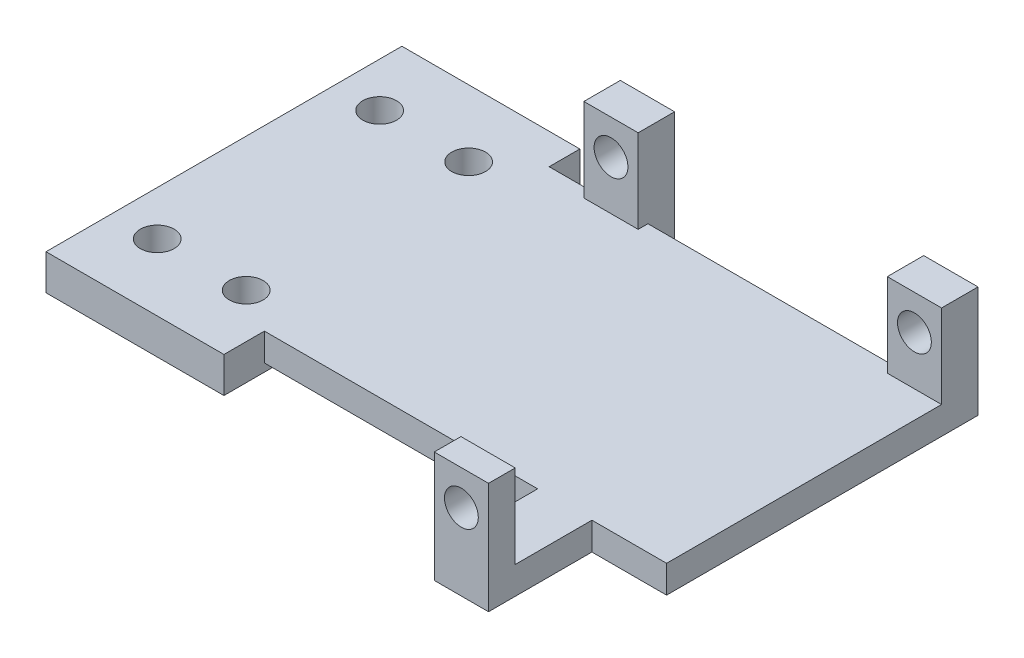
ISO-10303-21;
HEADER;
FILE_DESCRIPTION(('STEP AP214'),'2;1');
FILE_NAME('part.step','',(''),(''),'','','');
FILE_SCHEMA(('AUTOMOTIVE_DESIGN { 1 0 10303 214 1 1 1 1 }'));
ENDSEC;
DATA;
#1=APPLICATION_CONTEXT('core data for automotive mechanical design processes');
#2=APPLICATION_PROTOCOL_DEFINITION('international standard','automotive_design',2000,#1);
#3=PRODUCT_CONTEXT('',#1,'mechanical');
#4=PRODUCT('Part','Part','',(#3));
#5=PRODUCT_RELATED_PRODUCT_CATEGORY('part','',(#4));
#6=PRODUCT_DEFINITION_FORMATION('','',#4);
#7=PRODUCT_DEFINITION_CONTEXT('part definition',#1,'design');
#8=PRODUCT_DEFINITION('design','',#6,#7);
#9=PRODUCT_DEFINITION_SHAPE('','',#8);
#10=(LENGTH_UNIT() NAMED_UNIT(*) SI_UNIT(.MILLI.,.METRE.));
#11=(NAMED_UNIT(*) PLANE_ANGLE_UNIT() SI_UNIT($,.RADIAN.));
#12=(NAMED_UNIT(*) SI_UNIT($,.STERADIAN.) SOLID_ANGLE_UNIT());
#13=UNCERTAINTY_MEASURE_WITH_UNIT(LENGTH_MEASURE(1.E-05),#10,'distance_accuracy_value','');
#14=(GEOMETRIC_REPRESENTATION_CONTEXT(3) GLOBAL_UNCERTAINTY_ASSIGNED_CONTEXT((#13)) GLOBAL_UNIT_ASSIGNED_CONTEXT((#10,
#11,#12)) REPRESENTATION_CONTEXT('',''));
#15=CARTESIAN_POINT('',(0.,0.,0.));
#16=DIRECTION('',(0.,0.,1.));
#17=DIRECTION('',(1.,0.,0.));
#18=AXIS2_PLACEMENT_3D('',#15,#16,#17);
#19=CARTESIAN_POINT('',(-15.,-1.89713612671244,-32.));
#20=DIRECTION('',(0.,0.,-1.));
#21=DIRECTION('',(-1.,0.,0.));
#22=AXIS2_PLACEMENT_3D('',#19,#20,#21);
#23=PLANE('',#22);
#24=DIRECTION('',(0.,-1.,0.));
#25=VECTOR('',#24,1.);
#26=CARTESIAN_POINT('',(0.,-1.89713612671244,-32.));
#27=LINE('',#26,#25);
#28=CARTESIAN_POINT('',(0.,-1.89713612671244,-32.));
#29=VERTEX_POINT('',#28);
#30=CARTESIAN_POINT('',(0.,-5.,-32.));
#31=VERTEX_POINT('',#30);
#32=EDGE_CURVE('E56',#29,#31,#27,.T.);
#33=ORIENTED_EDGE('',*,*,#32,.F.);
#34=DIRECTION('',(1.,0.,0.));
#35=VECTOR('',#34,1.);
#36=CARTESIAN_POINT('',(-15.,-1.89713612671244,-32.));
#37=LINE('',#36,#35);
#38=CARTESIAN_POINT('',(5.,-1.89713612671244,-32.));
#39=VERTEX_POINT('',#38);
#40=EDGE_CURVE('E35',#29,#39,#37,.T.);
#41=ORIENTED_EDGE('',*,*,#40,.T.);
#42=DIRECTION('',(0.,1.,0.));
#43=VECTOR('',#42,1.);
#44=CARTESIAN_POINT('',(4.99999999999999,7.50286387328756,-32.));
#45=LINE('',#44,#43);
#46=CARTESIAN_POINT('',(5.,-5.,-32.));
#47=VERTEX_POINT('',#46);
#48=EDGE_CURVE('E251',#47,#39,#45,.T.);
#49=ORIENTED_EDGE('',*,*,#48,.F.);
#50=DIRECTION('',(1.,0.,0.));
#51=VECTOR('',#50,1.);
#52=CARTESIAN_POINT('',(-15.,-5.,-32.));
#53=LINE('',#52,#51);
#54=EDGE_CURVE('E366',#31,#47,#53,.T.);
#55=ORIENTED_EDGE('',*,*,#54,.F.);
#56=EDGE_LOOP('',(#33,#41,#49,#55));
#57=FACE_BOUND('',#56,.T.);
#58=ADVANCED_FACE('F32',(#57),#23,.T.);
#59=CARTESIAN_POINT('',(11.1,-5.,-32.));
#60=VERTEX_POINT('',#59);
#61=CARTESIAN_POINT('',(39.1,-5.,-32.));
#62=VERTEX_POINT('',#61);
#63=EDGE_CURVE('E363',#60,#62,#53,.T.);
#64=ORIENTED_EDGE('',*,*,#63,.F.);
#65=DIRECTION('',(0.,-1.,0.));
#66=VECTOR('',#65,1.);
#67=CARTESIAN_POINT('',(11.1,-1.89713612671244,-32.));
#68=LINE('',#67,#66);
#69=CARTESIAN_POINT('',(11.1,-1.89713612671244,-32.));
#70=VERTEX_POINT('',#69);
#71=EDGE_CURVE('E256',#70,#60,#68,.T.);
#72=ORIENTED_EDGE('',*,*,#71,.F.);
#73=CARTESIAN_POINT('',(39.1,-1.89713612671244,-32.));
#74=VERTEX_POINT('',#73);
#75=EDGE_CURVE('E375',#70,#74,#37,.T.);
#76=ORIENTED_EDGE('',*,*,#75,.T.);
#77=DIRECTION('',(0.,1.,0.));
#78=VECTOR('',#77,1.);
#79=CARTESIAN_POINT('',(39.1,7.50286387328753,-32.));
#80=LINE('',#79,#78);
#81=EDGE_CURVE('E277',#62,#74,#80,.T.);
#82=ORIENTED_EDGE('',*,*,#81,.F.);
#83=EDGE_LOOP('',(#64,#72,#76,#82));
#84=FACE_BOUND('',#83,.T.);
#85=ADVANCED_FACE('F483',(#84),#23,.T.);
#86=CARTESIAN_POINT('',(-15.,-1.89713612671244,0.));
#87=DIRECTION('',(0.,0.,1.));
#88=DIRECTION('',(1.,0.,0.));
#89=AXIS2_PLACEMENT_3D('',#86,#87,#88);
#90=PLANE('',#89);
#91=DIRECTION('',(0.,1.,0.));
#92=VECTOR('',#91,1.);
#93=CARTESIAN_POINT('',(0.,-1.89713612671244,0.));
#94=LINE('',#93,#92);
#95=CARTESIAN_POINT('',(0.,-5.,0.));
#96=VERTEX_POINT('',#95);
#97=CARTESIAN_POINT('',(0.,-1.89713612671244,0.));
#98=VERTEX_POINT('',#97);
#99=EDGE_CURVE('E241',#96,#98,#94,.T.);
#100=ORIENTED_EDGE('',*,*,#99,.F.);
#101=DIRECTION('',(-1.,0.,0.));
#102=VECTOR('',#101,1.);
#103=CARTESIAN_POINT('',(-15.,-5.,0.));
#104=LINE('',#103,#102);
#105=CARTESIAN_POINT('',(30.71,-5.,0.));
#106=VERTEX_POINT('',#105);
#107=EDGE_CURVE('E379',#106,#96,#104,.T.);
#108=ORIENTED_EDGE('',*,*,#107,.F.);
#109=DIRECTION('',(0.,1.,0.));
#110=VECTOR('',#109,1.);
#111=CARTESIAN_POINT('',(30.71,-18.1254542411129,0.));
#112=LINE('',#111,#110);
#113=CARTESIAN_POINT('',(30.71,-1.89713612671244,0.));
#114=VERTEX_POINT('',#113);
#115=EDGE_CURVE('E332',#106,#114,#112,.T.);
#116=ORIENTED_EDGE('',*,*,#115,.T.);
#117=DIRECTION('',(-1.,0.,0.));
#118=VECTOR('',#117,1.);
#119=CARTESIAN_POINT('',(-15.,-1.89713612671244,0.));
#120=LINE('',#119,#118);
#121=EDGE_CURVE('E48',#114,#98,#120,.T.);
#122=ORIENTED_EDGE('',*,*,#121,.T.);
#123=EDGE_LOOP('',(#100,#108,#116,#122));
#124=FACE_BOUND('',#123,.T.);
#125=ADVANCED_FACE('F528',(#124),#90,.T.);
#126=CARTESIAN_POINT('',(0.,-1.89713612671244,0.));
#127=DIRECTION('',(0.,-1.,0.));
#128=DIRECTION('',(0.,0.,-1.));
#129=AXIS2_PLACEMENT_3D('',#126,#127,#128);
#130=PLANE('',#129);
#131=CARTESIAN_POINT('',(-5.,-1.89713612671244,-2.9525));
#132=DIRECTION('',(0.,1.,0.));
#133=DIRECTION('',(0.,0.,1.));
#134=AXIS2_PLACEMENT_3D('',#131,#132,#133);
#135=CIRCLE('',#134,1.9);
#136=CARTESIAN_POINT('',(-5.,-1.89713612671244,-1.0525));
#137=VERTEX_POINT('',#136);
#138=EDGE_CURVE('E894',#137,#137,#135,.T.);
#139=ORIENTED_EDGE('',*,*,#138,.F.);
#140=EDGE_LOOP('',(#139));
#141=FACE_BOUND('',#140,.T.);
#142=CARTESIAN_POINT('',(-15.,-1.89713612671244,-2.9525));
#143=DIRECTION('',(0.,1.,0.));
#144=DIRECTION('',(0.,0.,1.));
#145=AXIS2_PLACEMENT_3D('',#142,#143,#144);
#146=CIRCLE('',#145,1.9);
#147=CARTESIAN_POINT('',(-15.,-1.89713612671244,-1.0525));
#148=VERTEX_POINT('',#147);
#149=EDGE_CURVE('E896',#148,#148,#146,.T.);
#150=ORIENTED_EDGE('',*,*,#149,.F.);
#151=EDGE_LOOP('',(#150));
#152=FACE_BOUND('',#151,.T.);
#153=CARTESIAN_POINT('',(-5.,-1.89713612671244,-27.9525));
#154=DIRECTION('',(0.,1.,0.));
#155=DIRECTION('',(0.,0.,1.));
#156=AXIS2_PLACEMENT_3D('',#153,#154,#155);
#157=CIRCLE('',#156,1.9);
#158=CARTESIAN_POINT('',(-5.,-1.89713612671244,-26.0525));
#159=VERTEX_POINT('',#158);
#160=EDGE_CURVE('E902',#159,#159,#157,.T.);
#161=ORIENTED_EDGE('',*,*,#160,.F.);
#162=EDGE_LOOP('',(#161));
#163=FACE_BOUND('',#162,.T.);
#164=CARTESIAN_POINT('',(-15.,-1.89713612671244,-27.9525));
#165=DIRECTION('',(0.,1.,0.));
#166=DIRECTION('',(0.,0.,1.));
#167=AXIS2_PLACEMENT_3D('',#164,#165,#166);
#168=CIRCLE('',#167,1.89999999999999);
#169=CARTESIAN_POINT('',(-15.,-1.89713612671244,-26.0525));
#170=VERTEX_POINT('',#169);
#171=EDGE_CURVE('E228',#170,#170,#168,.T.);
#172=ORIENTED_EDGE('',*,*,#171,.F.);
#173=EDGE_LOOP('',(#172));
#174=FACE_BOUND('',#173,.T.);
#175=ORIENTED_EDGE('',*,*,#40,.F.);
#176=DIRECTION('',(0.,0.,-1.));
#177=VECTOR('',#176,1.);
#178=CARTESIAN_POINT('',(0.,-1.89713612671244,-35.4525));
#179=LINE('',#178,#177);
#180=CARTESIAN_POINT('',(0.,-1.89713612671244,-35.4525));
#181=VERTEX_POINT('',#180);
#182=EDGE_CURVE('E237',#29,#181,#179,.T.);
#183=ORIENTED_EDGE('',*,*,#182,.T.);
#184=DIRECTION('',(-1.,0.,0.));
#185=VECTOR('',#184,1.);
#186=CARTESIAN_POINT('',(-20.,-1.89713612671244,-35.4525));
#187=LINE('',#186,#185);
#188=CARTESIAN_POINT('',(-20.,-1.89713612671244,-35.4525));
#189=VERTEX_POINT('',#188);
#190=EDGE_CURVE('E222',#181,#189,#187,.T.);
#191=ORIENTED_EDGE('',*,*,#190,.T.);
#192=DIRECTION('',(0.,0.,1.));
#193=VECTOR('',#192,1.);
#194=CARTESIAN_POINT('',(-20.,-1.89713612671244,-35.4525));
#195=LINE('',#194,#193);
#196=CARTESIAN_POINT('',(-20.,-1.89713612671244,4.54750000000001));
#197=VERTEX_POINT('',#196);
#198=EDGE_CURVE('E233',#189,#197,#195,.T.);
#199=ORIENTED_EDGE('',*,*,#198,.T.);
#200=DIRECTION('',(1.,0.,0.));
#201=VECTOR('',#200,1.);
#202=CARTESIAN_POINT('',(-20.,-1.89713612671244,4.54750000000001));
#203=LINE('',#202,#201);
#204=CARTESIAN_POINT('',(0.,-1.89713612671244,4.54750000000001));
#205=VERTEX_POINT('',#204);
#206=EDGE_CURVE('E202',#197,#205,#203,.T.);
#207=ORIENTED_EDGE('',*,*,#206,.T.);
#208=EDGE_CURVE('E225',#205,#98,#179,.T.);
#209=ORIENTED_EDGE('',*,*,#208,.T.);
#210=ORIENTED_EDGE('',*,*,#121,.F.);
#211=DIRECTION('',(0.,0.,1.));
#212=VECTOR('',#211,1.);
#213=CARTESIAN_POINT('',(30.71,-1.89713612671244,11.621856522757));
#214=LINE('',#213,#212);
#215=CARTESIAN_POINT('',(30.71,-1.89713612671245,8.62185652275697));
#216=VERTEX_POINT('',#215);
#217=EDGE_CURVE('E319',#114,#216,#214,.T.);
#218=ORIENTED_EDGE('',*,*,#217,.T.);
#219=DIRECTION('',(1.,0.,0.));
#220=VECTOR('',#219,1.);
#221=CARTESIAN_POINT('',(30.71,-1.89713612671244,8.62185652275697));
#222=LINE('',#221,#220);
#223=CARTESIAN_POINT('',(36.81,-1.89713612671245,8.62185652275697));
#224=VERTEX_POINT('',#223);
#225=EDGE_CURVE('E305',#216,#224,#222,.T.);
#226=ORIENTED_EDGE('',*,*,#225,.T.);
#227=DIRECTION('',(0.,0.,-1.));
#228=VECTOR('',#227,1.);
#229=CARTESIAN_POINT('',(36.81,-1.89713612671244,11.621856522757));
#230=LINE('',#229,#228);
#231=CARTESIAN_POINT('',(36.81,-1.89713612671244,0.));
#232=VERTEX_POINT('',#231);
#233=EDGE_CURVE('E326',#224,#232,#230,.T.);
#234=ORIENTED_EDGE('',*,*,#233,.T.);
#235=CARTESIAN_POINT('',(45.2,-1.89713612671244,0.));
#236=VERTEX_POINT('',#235);
#237=EDGE_CURVE('E41',#236,#232,#120,.T.);
#238=ORIENTED_EDGE('',*,*,#237,.F.);
#239=DIRECTION('',(0.,0.,1.));
#240=VECTOR('',#239,1.);
#241=CARTESIAN_POINT('',(45.2,-1.89713612671244,0.));
#242=LINE('',#241,#240);
#243=CARTESIAN_POINT('',(45.2,-1.89713612671244,-30.905));
#244=VERTEX_POINT('',#243);
#245=EDGE_CURVE('E434',#244,#236,#242,.T.);
#246=ORIENTED_EDGE('',*,*,#245,.F.);
#247=DIRECTION('',(-1.,0.,0.));
#248=VECTOR('',#247,1.);
#249=CARTESIAN_POINT('',(39.1,-1.89713612671244,-30.905));
#250=LINE('',#249,#248);
#251=CARTESIAN_POINT('',(39.1,-1.89713612671244,-30.905));
#252=VERTEX_POINT('',#251);
#253=EDGE_CURVE('E424',#244,#252,#250,.T.);
#254=ORIENTED_EDGE('',*,*,#253,.T.);
#255=DIRECTION('',(0.,0.,1.));
#256=VECTOR('',#255,1.);
#257=CARTESIAN_POINT('',(39.1,-1.89713612671244,-43.2058020685714));
#258=LINE('',#257,#256);
#259=EDGE_CURVE('E353',#74,#252,#258,.T.);
#260=ORIENTED_EDGE('',*,*,#259,.F.);
#261=ORIENTED_EDGE('',*,*,#75,.F.);
#262=DIRECTION('',(0.,0.,1.));
#263=VECTOR('',#262,1.);
#264=CARTESIAN_POINT('',(11.1,-1.89713612671245,-43.2058020685714));
#265=LINE('',#264,#263);
#266=CARTESIAN_POINT('',(11.1,-1.89713612671245,-30.905));
#267=VERTEX_POINT('',#266);
#268=EDGE_CURVE('E367',#70,#267,#265,.T.);
#269=ORIENTED_EDGE('',*,*,#268,.T.);
#270=DIRECTION('',(-1.,0.,0.));
#271=VECTOR('',#270,1.);
#272=CARTESIAN_POINT('',(11.1,-1.89713612671245,-30.905));
#273=LINE('',#272,#271);
#274=CARTESIAN_POINT('',(5.,-1.89713612671245,-30.905));
#275=VERTEX_POINT('',#274);
#276=EDGE_CURVE('E405',#267,#275,#273,.T.);
#277=ORIENTED_EDGE('',*,*,#276,.T.);
#278=DIRECTION('',(0.,0.,1.));
#279=VECTOR('',#278,1.);
#280=CARTESIAN_POINT('',(5.,-1.89713612671245,-43.2058020685714));
#281=LINE('',#280,#279);
#282=EDGE_CURVE('E389',#39,#275,#281,.T.);
#283=ORIENTED_EDGE('',*,*,#282,.F.);
#284=EDGE_LOOP('',(#175,#183,#191,#199,#207,#209,#210,#218,#226,#234,#238,#246,#254,#260,#261,
#269,#277,#283));
#285=FACE_BOUND('',#284,.T.);
#286=ADVANCED_FACE('F459',(#141,#152,#163,#174,#285),#130,.F.);
#287=DIRECTION('',(0.,1.,0.));
#288=VECTOR('',#287,1.);
#289=CARTESIAN_POINT('',(36.81,-18.1254542411129,0.));
#290=LINE('',#289,#288);
#291=CARTESIAN_POINT('',(36.81,-5.,0.));
#292=VERTEX_POINT('',#291);
#293=EDGE_CURVE('E336',#292,#232,#290,.T.);
#294=ORIENTED_EDGE('',*,*,#293,.F.);
#295=CARTESIAN_POINT('',(45.2,-5.,0.));
#296=VERTEX_POINT('',#295);
#297=EDGE_CURVE('E381',#296,#292,#104,.T.);
#298=ORIENTED_EDGE('',*,*,#297,.F.);
#299=DIRECTION('',(0.,1.,0.));
#300=VECTOR('',#299,1.);
#301=CARTESIAN_POINT('',(45.2,-5.,0.));
#302=LINE('',#301,#300);
#303=EDGE_CURVE('E430',#296,#236,#302,.T.);
#304=ORIENTED_EDGE('',*,*,#303,.T.);
#305=ORIENTED_EDGE('',*,*,#237,.T.);
#306=EDGE_LOOP('',(#294,#298,#304,#305));
#307=FACE_BOUND('',#306,.T.);
#308=ADVANCED_FACE('F464',(#307),#90,.T.);
#309=CARTESIAN_POINT('',(0.,-5.,0.));
#310=DIRECTION('',(0.,-1.,0.));
#311=DIRECTION('',(0.,0.,-1.));
#312=AXIS2_PLACEMENT_3D('',#309,#310,#311);
#313=PLANE('',#312);
#314=DIRECTION('',(0.,0.,1.));
#315=VECTOR('',#314,1.);
#316=CARTESIAN_POINT('',(0.,-5.,0.));
#317=LINE('',#316,#315);
#318=EDGE_CURVE('E11',#31,#96,#317,.T.);
#319=ORIENTED_EDGE('',*,*,#318,.F.);
#320=ORIENTED_EDGE('',*,*,#54,.T.);
#321=DIRECTION('',(0.,0.,1.));
#322=VECTOR('',#321,1.);
#323=CARTESIAN_POINT('',(5.,-5.,-35.));
#324=LINE('',#323,#322);
#325=CARTESIAN_POINT('',(5.,-5.,-35.));
#326=VERTEX_POINT('',#325);
#327=EDGE_CURVE('E264',#326,#47,#324,.T.);
#328=ORIENTED_EDGE('',*,*,#327,.F.);
#329=DIRECTION('',(-1.,0.,0.));
#330=VECTOR('',#329,1.);
#331=CARTESIAN_POINT('',(11.1,-5.,-35.));
#332=LINE('',#331,#330);
#333=CARTESIAN_POINT('',(11.1,-5.,-35.));
#334=VERTEX_POINT('',#333);
#335=EDGE_CURVE('E255',#334,#326,#332,.T.);
#336=ORIENTED_EDGE('',*,*,#335,.F.);
#337=DIRECTION('',(0.,0.,1.));
#338=VECTOR('',#337,1.);
#339=CARTESIAN_POINT('',(11.1,-5.,-35.));
#340=LINE('',#339,#338);
#341=EDGE_CURVE('E278',#334,#60,#340,.T.);
#342=ORIENTED_EDGE('',*,*,#341,.T.);
#343=ORIENTED_EDGE('',*,*,#63,.T.);
#344=DIRECTION('',(0.,0.,1.));
#345=VECTOR('',#344,1.);
#346=CARTESIAN_POINT('',(39.1,-5.,-35.));
#347=LINE('',#346,#345);
#348=CARTESIAN_POINT('',(39.1,-5.,-35.));
#349=VERTEX_POINT('',#348);
#350=EDGE_CURVE('E290',#349,#62,#347,.T.);
#351=ORIENTED_EDGE('',*,*,#350,.F.);
#352=DIRECTION('',(-1.,0.,0.));
#353=VECTOR('',#352,1.);
#354=CARTESIAN_POINT('',(45.2,-5.,-35.));
#355=LINE('',#354,#353);
#356=CARTESIAN_POINT('',(45.2,-5.,-35.));
#357=VERTEX_POINT('',#356);
#358=EDGE_CURVE('E282',#357,#349,#355,.T.);
#359=ORIENTED_EDGE('',*,*,#358,.F.);
#360=DIRECTION('',(0.,0.,1.));
#361=VECTOR('',#360,1.);
#362=CARTESIAN_POINT('',(45.2,-5.,0.));
#363=LINE('',#362,#361);
#364=EDGE_CURVE('E433',#357,#296,#363,.T.);
#365=ORIENTED_EDGE('',*,*,#364,.T.);
#366=ORIENTED_EDGE('',*,*,#297,.T.);
#367=DIRECTION('',(0.,0.,-1.));
#368=VECTOR('',#367,1.);
#369=CARTESIAN_POINT('',(36.81,-5.,11.621856522757));
#370=LINE('',#369,#368);
#371=CARTESIAN_POINT('',(36.81,-5.,11.621856522757));
#372=VERTEX_POINT('',#371);
#373=EDGE_CURVE('E346',#372,#292,#370,.T.);
#374=ORIENTED_EDGE('',*,*,#373,.F.);
#375=DIRECTION('',(1.,0.,0.));
#376=VECTOR('',#375,1.);
#377=CARTESIAN_POINT('',(30.71,-5.,11.621856522757));
#378=LINE('',#377,#376);
#379=CARTESIAN_POINT('',(30.71,-5.,11.621856522757));
#380=VERTEX_POINT('',#379);
#381=EDGE_CURVE('E322',#380,#372,#378,.T.);
#382=ORIENTED_EDGE('',*,*,#381,.F.);
#383=DIRECTION('',(0.,0.,1.));
#384=VECTOR('',#383,1.);
#385=CARTESIAN_POINT('',(30.71,-5.,11.621856522757));
#386=LINE('',#385,#384);
#387=EDGE_CURVE('E335',#106,#380,#386,.T.);
#388=ORIENTED_EDGE('',*,*,#387,.F.);
#389=ORIENTED_EDGE('',*,*,#107,.T.);
#390=EDGE_LOOP('',(#319,#320,#328,#336,#342,#343,#351,#359,#365,#366,#374,#382,#388,#389));
#391=FACE_BOUND('',#390,.T.);
#392=ADVANCED_FACE('F499',(#391),#313,.T.);
#393=CARTESIAN_POINT('',(11.1,7.50286387328754,-43.2058020685714));
#394=DIRECTION('',(0.,-1.,0.));
#395=DIRECTION('',(1.,0.,0.));
#396=AXIS2_PLACEMENT_3D('',#393,#394,#395);
#397=PLANE('',#396);
#398=DIRECTION('',(0.,0.,1.));
#399=VECTOR('',#398,1.);
#400=CARTESIAN_POINT('',(11.1,7.50286387328754,-43.2058020685714));
#401=LINE('',#400,#399);
#402=CARTESIAN_POINT('',(11.1,7.50286387328754,-35.));
#403=VERTEX_POINT('',#402);
#404=CARTESIAN_POINT('',(11.1,7.50286387328754,-30.905));
#405=VERTEX_POINT('',#404);
#406=EDGE_CURVE('E397',#403,#405,#401,.T.);
#407=ORIENTED_EDGE('',*,*,#406,.F.);
#408=DIRECTION('',(1.,0.,0.));
#409=VECTOR('',#408,1.);
#410=CARTESIAN_POINT('',(11.1,7.50286387328754,-35.));
#411=LINE('',#410,#409);
#412=CARTESIAN_POINT('',(4.99999999999999,7.50286387328756,-35.));
#413=VERTEX_POINT('',#412);
#414=EDGE_CURVE('E261',#413,#403,#411,.T.);
#415=ORIENTED_EDGE('',*,*,#414,.F.);
#416=DIRECTION('',(0.,0.,1.));
#417=VECTOR('',#416,1.);
#418=CARTESIAN_POINT('',(4.99999999999999,7.50286387328756,-43.2058020685714));
#419=LINE('',#418,#417);
#420=CARTESIAN_POINT('',(4.99999999999999,7.50286387328756,-30.905));
#421=VERTEX_POINT('',#420);
#422=EDGE_CURVE('E393',#413,#421,#419,.T.);
#423=ORIENTED_EDGE('',*,*,#422,.T.);
#424=DIRECTION('',(1.,0.,0.));
#425=VECTOR('',#424,1.);
#426=CARTESIAN_POINT('',(11.1,7.50286387328754,-30.905));
#427=LINE('',#426,#425);
#428=EDGE_CURVE('E399',#421,#405,#427,.T.);
#429=ORIENTED_EDGE('',*,*,#428,.T.);
#430=EDGE_LOOP('',(#407,#415,#423,#429));
#431=FACE_BOUND('',#430,.T.);
#432=ADVANCED_FACE('F514',(#431),#397,.F.);
#433=CARTESIAN_POINT('',(5.,-1.89713612671245,-43.2058020685714));
#434=DIRECTION('',(1.,0.,0.));
#435=DIRECTION('',(0.,1.,0.));
#436=AXIS2_PLACEMENT_3D('',#433,#434,#435);
#437=PLANE('',#436);
#438=ORIENTED_EDGE('',*,*,#422,.F.);
#439=DIRECTION('',(0.,1.,0.));
#440=VECTOR('',#439,1.);
#441=CARTESIAN_POINT('',(5.,-5.,-35.));
#442=LINE('',#441,#440);
#443=EDGE_CURVE('E258',#326,#413,#442,.T.);
#444=ORIENTED_EDGE('',*,*,#443,.F.);
#445=ORIENTED_EDGE('',*,*,#327,.T.);
#446=ORIENTED_EDGE('',*,*,#48,.T.);
#447=ORIENTED_EDGE('',*,*,#282,.T.);
#448=DIRECTION('',(0.,1.,0.));
#449=VECTOR('',#448,1.);
#450=CARTESIAN_POINT('',(5.,-1.89713612671245,-30.905));
#451=LINE('',#450,#449);
#452=EDGE_CURVE('E402',#275,#421,#451,.T.);
#453=ORIENTED_EDGE('',*,*,#452,.T.);
#454=EDGE_LOOP('',(#438,#444,#445,#446,#447,#453));
#455=FACE_BOUND('',#454,.T.);
#456=ADVANCED_FACE('F493',(#455),#437,.F.);
#457=CARTESIAN_POINT('',(11.1,-1.89713612671245,-43.2058020685714));
#458=DIRECTION('',(-1.,0.,0.));
#459=DIRECTION('',(0.,-1.,0.));
#460=AXIS2_PLACEMENT_3D('',#457,#458,#459);
#461=PLANE('',#460);
#462=ORIENTED_EDGE('',*,*,#268,.F.);
#463=ORIENTED_EDGE('',*,*,#71,.T.);
#464=ORIENTED_EDGE('',*,*,#341,.F.);
#465=DIRECTION('',(0.,-1.,0.));
#466=VECTOR('',#465,1.);
#467=CARTESIAN_POINT('',(11.1,-1.89713612671244,-35.));
#468=LINE('',#467,#466);
#469=EDGE_CURVE('E252',#403,#334,#468,.T.);
#470=ORIENTED_EDGE('',*,*,#469,.F.);
#471=ORIENTED_EDGE('',*,*,#406,.T.);
#472=DIRECTION('',(0.,-1.,0.));
#473=VECTOR('',#472,1.);
#474=CARTESIAN_POINT('',(11.1,-1.89713612671245,-30.905));
#475=LINE('',#474,#473);
#476=EDGE_CURVE('E407',#405,#267,#475,.T.);
#477=ORIENTED_EDGE('',*,*,#476,.T.);
#478=EDGE_LOOP('',(#462,#463,#464,#470,#471,#477));
#479=FACE_BOUND('',#478,.T.);
#480=ADVANCED_FACE('F503',(#479),#461,.F.);
#481=CARTESIAN_POINT('',(0.,0.,-30.905));
#482=DIRECTION('',(0.,0.,1.));
#483=DIRECTION('',(1.,0.,0.));
#484=AXIS2_PLACEMENT_3D('',#481,#482,#483);
#485=PLANE('',#484);
#486=ORIENTED_EDGE('',*,*,#476,.F.);
#487=ORIENTED_EDGE('',*,*,#428,.F.);
#488=ORIENTED_EDGE('',*,*,#452,.F.);
#489=ORIENTED_EDGE('',*,*,#276,.F.);
#490=EDGE_LOOP('',(#486,#487,#488,#489));
#491=FACE_BOUND('',#490,.T.);
#492=CARTESIAN_POINT('',(8.04999999999998,3.60286387328756,-30.905));
#493=DIRECTION('',(0.,0.,-1.));
#494=DIRECTION('',(-1.,0.,0.));
#495=AXIS2_PLACEMENT_3D('',#492,#493,#494);
#496=CIRCLE('',#495,1.9);
#497=CARTESIAN_POINT('',(6.14999999999998,3.60286387328756,-30.905));
#498=VERTEX_POINT('',#497);
#499=EDGE_CURVE('E355',#498,#498,#496,.T.);
#500=ORIENTED_EDGE('',*,*,#499,.T.);
#501=EDGE_LOOP('',(#500));
#502=FACE_BOUND('',#501,.T.);
#503=ADVANCED_FACE('F506',(#491,#502),#485,.T.);
#504=CARTESIAN_POINT('',(8.04999999999998,3.60286387328756,-43.2058020685714));
#505=DIRECTION('',(0.,0.,1.));
#506=DIRECTION('',(1.,0.,0.));
#507=AXIS2_PLACEMENT_3D('',#504,#505,#506);
#508=CYLINDRICAL_SURFACE('',#507,1.9);
#509=ORIENTED_EDGE('',*,*,#499,.F.);
#510=EDGE_LOOP('',(#509));
#511=FACE_BOUND('',#510,.T.);
#512=CARTESIAN_POINT('',(8.04999999999998,3.60286387328756,-35.));
#513=DIRECTION('',(0.,0.,-1.));
#514=DIRECTION('',(-1.,0.,0.));
#515=AXIS2_PLACEMENT_3D('',#512,#513,#514);
#516=CIRCLE('',#515,1.9);
#517=CARTESIAN_POINT('',(6.14999999999998,3.60286387328756,-35.));
#518=VERTEX_POINT('',#517);
#519=EDGE_CURVE('E248',#518,#518,#516,.T.);
#520=ORIENTED_EDGE('',*,*,#519,.T.);
#521=EDGE_LOOP('',(#520));
#522=FACE_BOUND('',#521,.T.);
#523=ADVANCED_FACE('F680',(#511,#522),#508,.F.);
#524=CARTESIAN_POINT('',(45.2,-1.89713612671245,-43.2058020685714));
#525=DIRECTION('',(-1.,0.,0.));
#526=DIRECTION('',(0.,-1.,0.));
#527=AXIS2_PLACEMENT_3D('',#524,#525,#526);
#528=PLANE('',#527);
#529=ORIENTED_EDGE('',*,*,#364,.F.);
#530=DIRECTION('',(0.,-1.,0.));
#531=VECTOR('',#530,1.);
#532=CARTESIAN_POINT('',(45.2,7.50286387328753,-35.));
#533=LINE('',#532,#531);
#534=CARTESIAN_POINT('',(45.2,7.50286387328753,-35.));
#535=VERTEX_POINT('',#534);
#536=EDGE_CURVE('E279',#535,#357,#533,.T.);
#537=ORIENTED_EDGE('',*,*,#536,.F.);
#538=DIRECTION('',(0.,0.,1.));
#539=VECTOR('',#538,1.);
#540=CARTESIAN_POINT('',(45.2,7.50286387328753,-43.2058020685714));
#541=LINE('',#540,#539);
#542=CARTESIAN_POINT('',(45.2,7.50286387328753,-30.905));
#543=VERTEX_POINT('',#542);
#544=EDGE_CURVE('E413',#535,#543,#541,.T.);
#545=ORIENTED_EDGE('',*,*,#544,.T.);
#546=DIRECTION('',(0.,-1.,0.));
#547=VECTOR('',#546,1.);
#548=CARTESIAN_POINT('',(45.2,-1.89713612671245,-30.905));
#549=LINE('',#548,#547);
#550=EDGE_CURVE('E415',#543,#244,#549,.T.);
#551=ORIENTED_EDGE('',*,*,#550,.T.);
#552=ORIENTED_EDGE('',*,*,#245,.T.);
#553=ORIENTED_EDGE('',*,*,#303,.F.);
#554=EDGE_LOOP('',(#529,#537,#545,#551,#552,#553));
#555=FACE_BOUND('',#554,.T.);
#556=ADVANCED_FACE('F468',(#555),#528,.F.);
#557=CARTESIAN_POINT('',(39.1,7.50286387328753,-43.2058020685714));
#558=DIRECTION('',(0.,-1.,0.));
#559=DIRECTION('',(1.,0.,0.));
#560=AXIS2_PLACEMENT_3D('',#557,#558,#559);
#561=PLANE('',#560);
#562=ORIENTED_EDGE('',*,*,#544,.F.);
#563=DIRECTION('',(1.,0.,0.));
#564=VECTOR('',#563,1.);
#565=CARTESIAN_POINT('',(45.2,7.50286387328753,-35.));
#566=LINE('',#565,#564);
#567=CARTESIAN_POINT('',(39.1,7.50286387328753,-35.));
#568=VERTEX_POINT('',#567);
#569=EDGE_CURVE('E287',#568,#535,#566,.T.);
#570=ORIENTED_EDGE('',*,*,#569,.F.);
#571=DIRECTION('',(0.,0.,1.));
#572=VECTOR('',#571,1.);
#573=CARTESIAN_POINT('',(39.1,7.50286387328753,-43.2058020685714));
#574=LINE('',#573,#572);
#575=CARTESIAN_POINT('',(39.1,7.50286387328753,-30.905));
#576=VERTEX_POINT('',#575);
#577=EDGE_CURVE('E356',#568,#576,#574,.T.);
#578=ORIENTED_EDGE('',*,*,#577,.T.);
#579=DIRECTION('',(1.,0.,0.));
#580=VECTOR('',#579,1.);
#581=CARTESIAN_POINT('',(39.1,7.50286387328753,-30.905));
#582=LINE('',#581,#580);
#583=EDGE_CURVE('E418',#576,#543,#582,.T.);
#584=ORIENTED_EDGE('',*,*,#583,.T.);
#585=EDGE_LOOP('',(#562,#570,#578,#584));
#586=FACE_BOUND('',#585,.T.);
#587=ADVANCED_FACE('F679',(#586),#561,.F.);
#588=CARTESIAN_POINT('',(39.1,-1.89713612671244,-43.2058020685714));
#589=DIRECTION('',(1.,0.,0.));
#590=DIRECTION('',(0.,0.,-1.));
#591=AXIS2_PLACEMENT_3D('',#588,#589,#590);
#592=PLANE('',#591);
#593=ORIENTED_EDGE('',*,*,#577,.F.);
#594=DIRECTION('',(0.,1.,0.));
#595=VECTOR('',#594,1.);
#596=CARTESIAN_POINT('',(39.1,-5.,-35.));
#597=LINE('',#596,#595);
#598=EDGE_CURVE('E284',#349,#568,#597,.T.);
#599=ORIENTED_EDGE('',*,*,#598,.F.);
#600=ORIENTED_EDGE('',*,*,#350,.T.);
#601=ORIENTED_EDGE('',*,*,#81,.T.);
#602=ORIENTED_EDGE('',*,*,#259,.T.);
#603=DIRECTION('',(0.,1.,0.));
#604=VECTOR('',#603,1.);
#605=CARTESIAN_POINT('',(39.1,-1.89713612671244,-30.905));
#606=LINE('',#605,#604);
#607=EDGE_CURVE('E421',#252,#576,#606,.T.);
#608=ORIENTED_EDGE('',*,*,#607,.T.);
#609=EDGE_LOOP('',(#593,#599,#600,#601,#602,#608));
#610=FACE_BOUND('',#609,.T.);
#611=ADVANCED_FACE('F476',(#610),#592,.F.);
#612=CARTESIAN_POINT('',(0.,0.,-30.905));
#613=DIRECTION('',(0.,0.,1.));
#614=DIRECTION('',(1.,0.,0.));
#615=AXIS2_PLACEMENT_3D('',#612,#613,#614);
#616=PLANE('',#615);
#617=ORIENTED_EDGE('',*,*,#253,.F.);
#618=ORIENTED_EDGE('',*,*,#550,.F.);
#619=ORIENTED_EDGE('',*,*,#583,.F.);
#620=ORIENTED_EDGE('',*,*,#607,.F.);
#621=EDGE_LOOP('',(#617,#618,#619,#620));
#622=FACE_BOUND('',#621,.T.);
#623=CARTESIAN_POINT('',(42.15,3.60286387328753,-30.905));
#624=DIRECTION('',(0.,0.,-1.));
#625=DIRECTION('',(1.,0.,0.));
#626=AXIS2_PLACEMENT_3D('',#623,#624,#625);
#627=CIRCLE('',#626,1.9);
#628=CARTESIAN_POINT('',(44.05,3.60286387328753,-30.905));
#629=VERTEX_POINT('',#628);
#630=EDGE_CURVE('E427',#629,#629,#627,.T.);
#631=ORIENTED_EDGE('',*,*,#630,.T.);
#632=EDGE_LOOP('',(#631));
#633=FACE_BOUND('',#632,.T.);
#634=ADVANCED_FACE('F473',(#622,#633),#616,.T.);
#635=CARTESIAN_POINT('',(42.15,3.60286387328753,-43.2058020685714));
#636=DIRECTION('',(0.,0.,1.));
#637=DIRECTION('',(1.,0.,0.));
#638=AXIS2_PLACEMENT_3D('',#635,#636,#637);
#639=CYLINDRICAL_SURFACE('',#638,1.9);
#640=ORIENTED_EDGE('',*,*,#630,.F.);
#641=EDGE_LOOP('',(#640));
#642=FACE_BOUND('',#641,.T.);
#643=CARTESIAN_POINT('',(42.15,3.60286387328753,-35.));
#644=DIRECTION('',(0.,0.,-1.));
#645=DIRECTION('',(-1.,0.,0.));
#646=AXIS2_PLACEMENT_3D('',#643,#644,#645);
#647=CIRCLE('',#646,1.9);
#648=CARTESIAN_POINT('',(40.25,3.60286387328753,-35.));
#649=VERTEX_POINT('',#648);
#650=EDGE_CURVE('E274',#649,#649,#647,.T.);
#651=ORIENTED_EDGE('',*,*,#650,.T.);
#652=EDGE_LOOP('',(#651));
#653=FACE_BOUND('',#652,.T.);
#654=ADVANCED_FACE('F671',(#642,#653),#639,.F.);
#655=CARTESIAN_POINT('',(30.71,-18.1254542411129,11.621856522757));
#656=DIRECTION('',(0.,0.,1.));
#657=DIRECTION('',(1.,0.,0.));
#658=AXIS2_PLACEMENT_3D('',#655,#656,#657);
#659=PLANE('',#658);
#660=DIRECTION('',(0.,1.,0.));
#661=VECTOR('',#660,1.);
#662=CARTESIAN_POINT('',(30.71,-18.1254542411129,11.621856522757));
#663=LINE('',#662,#661);
#664=CARTESIAN_POINT('',(30.71,7.50286387328756,11.621856522757));
#665=VERTEX_POINT('',#664);
#666=EDGE_CURVE('E341',#380,#665,#663,.T.);
#667=ORIENTED_EDGE('',*,*,#666,.F.);
#668=ORIENTED_EDGE('',*,*,#381,.T.);
#669=DIRECTION('',(0.,1.,0.));
#670=VECTOR('',#669,1.);
#671=CARTESIAN_POINT('',(36.81,-18.1254542411129,11.621856522757));
#672=LINE('',#671,#670);
#673=CARTESIAN_POINT('',(36.81,7.50286387328756,11.621856522757));
#674=VERTEX_POINT('',#673);
#675=EDGE_CURVE('E325',#372,#674,#672,.T.);
#676=ORIENTED_EDGE('',*,*,#675,.T.);
#677=DIRECTION('',(-1.,0.,0.));
#678=VECTOR('',#677,1.);
#679=CARTESIAN_POINT('',(30.71,7.50286387328756,11.621856522757));
#680=LINE('',#679,#678);
#681=EDGE_CURVE('E298',#674,#665,#680,.T.);
#682=ORIENTED_EDGE('',*,*,#681,.T.);
#683=EDGE_LOOP('',(#667,#668,#676,#682));
#684=FACE_BOUND('',#683,.T.);
#685=CARTESIAN_POINT('',(33.76,3.60286387328756,11.621856522757));
#686=DIRECTION('',(0.,0.,1.));
#687=DIRECTION('',(1.,0.,0.));
#688=AXIS2_PLACEMENT_3D('',#685,#686,#687);
#689=CIRCLE('',#688,1.9);
#690=CARTESIAN_POINT('',(35.66,3.60286387328756,11.621856522757));
#691=VERTEX_POINT('',#690);
#692=EDGE_CURVE('E299',#691,#691,#689,.T.);
#693=ORIENTED_EDGE('',*,*,#692,.F.);
#694=EDGE_LOOP('',(#693));
#695=FACE_BOUND('',#694,.T.);
#696=ADVANCED_FACE('F441',(#684,#695),#659,.T.);
#697=CARTESIAN_POINT('',(36.81,-18.1254542411129,11.621856522757));
#698=DIRECTION('',(1.,0.,0.));
#699=DIRECTION('',(0.,0.,-1.));
#700=AXIS2_PLACEMENT_3D('',#697,#698,#699);
#701=PLANE('',#700);
#702=ORIENTED_EDGE('',*,*,#675,.F.);
#703=ORIENTED_EDGE('',*,*,#373,.T.);
#704=ORIENTED_EDGE('',*,*,#293,.T.);
#705=ORIENTED_EDGE('',*,*,#233,.F.);
#706=DIRECTION('',(0.,1.,0.));
#707=VECTOR('',#706,1.);
#708=CARTESIAN_POINT('',(36.81,-1.89713612671244,8.62185652275697));
#709=LINE('',#708,#707);
#710=CARTESIAN_POINT('',(36.81,7.50286387328756,8.62185652275697));
#711=VERTEX_POINT('',#710);
#712=EDGE_CURVE('E307',#224,#711,#709,.T.);
#713=ORIENTED_EDGE('',*,*,#712,.T.);
#714=DIRECTION('',(0.,0.,1.));
#715=VECTOR('',#714,1.);
#716=CARTESIAN_POINT('',(36.81,7.50286387328756,8.62185652275697));
#717=LINE('',#716,#715);
#718=EDGE_CURVE('E313',#711,#674,#717,.T.);
#719=ORIENTED_EDGE('',*,*,#718,.T.);
#720=EDGE_LOOP('',(#702,#703,#704,#705,#713,#719));
#721=FACE_BOUND('',#720,.T.);
#722=ADVANCED_FACE('F445',(#721),#701,.T.);
#723=CARTESIAN_POINT('',(30.71,-18.1254542411129,11.621856522757));
#724=DIRECTION('',(-1.,0.,0.));
#725=DIRECTION('',(0.,0.,1.));
#726=AXIS2_PLACEMENT_3D('',#723,#724,#725);
#727=PLANE('',#726);
#728=ORIENTED_EDGE('',*,*,#115,.F.);
#729=ORIENTED_EDGE('',*,*,#387,.T.);
#730=ORIENTED_EDGE('',*,*,#666,.T.);
#731=DIRECTION('',(0.,0.,1.));
#732=VECTOR('',#731,1.);
#733=CARTESIAN_POINT('',(30.71,7.50286387328756,8.62185652275697));
#734=LINE('',#733,#732);
#735=CARTESIAN_POINT('',(30.71,7.50286387328756,8.62185652275697));
#736=VERTEX_POINT('',#735);
#737=EDGE_CURVE('E316',#736,#665,#734,.T.);
#738=ORIENTED_EDGE('',*,*,#737,.F.);
#739=DIRECTION('',(0.,-1.,0.));
#740=VECTOR('',#739,1.);
#741=CARTESIAN_POINT('',(30.71,-1.89713612671244,8.62185652275697));
#742=LINE('',#741,#740);
#743=EDGE_CURVE('E302',#736,#216,#742,.T.);
#744=ORIENTED_EDGE('',*,*,#743,.T.);
#745=ORIENTED_EDGE('',*,*,#217,.F.);
#746=EDGE_LOOP('',(#728,#729,#730,#738,#744,#745));
#747=FACE_BOUND('',#746,.T.);
#748=ADVANCED_FACE('F454',(#747),#727,.T.);
#749=CARTESIAN_POINT('',(30.71,7.50286387328756,8.62185652275697));
#750=DIRECTION('',(0.,1.,0.));
#751=DIRECTION('',(-1.,0.,0.));
#752=AXIS2_PLACEMENT_3D('',#749,#750,#751);
#753=PLANE('',#752);
#754=ORIENTED_EDGE('',*,*,#681,.F.);
#755=ORIENTED_EDGE('',*,*,#718,.F.);
#756=DIRECTION('',(-1.,0.,0.));
#757=VECTOR('',#756,1.);
#758=CARTESIAN_POINT('',(30.71,7.50286387328756,8.62185652275697));
#759=LINE('',#758,#757);
#760=EDGE_CURVE('E310',#711,#736,#759,.T.);
#761=ORIENTED_EDGE('',*,*,#760,.T.);
#762=ORIENTED_EDGE('',*,*,#737,.T.);
#763=EDGE_LOOP('',(#754,#755,#761,#762));
#764=FACE_BOUND('',#763,.T.);
#765=ADVANCED_FACE('F450',(#764),#753,.T.);
#766=CARTESIAN_POINT('',(0.,0.,8.62185652275697));
#767=DIRECTION('',(0.,0.,-1.));
#768=DIRECTION('',(-1.,0.,0.));
#769=AXIS2_PLACEMENT_3D('',#766,#767,#768);
#770=PLANE('',#769);
#771=CARTESIAN_POINT('',(33.76,3.60286387328756,8.62185652275697));
#772=DIRECTION('',(0.,0.,1.));
#773=DIRECTION('',(1.,0.,0.));
#774=AXIS2_PLACEMENT_3D('',#771,#772,#773);
#775=CIRCLE('',#774,1.9);
#776=CARTESIAN_POINT('',(35.66,3.60286387328756,8.62185652275697));
#777=VERTEX_POINT('',#776);
#778=EDGE_CURVE('E295',#777,#777,#775,.T.);
#779=ORIENTED_EDGE('',*,*,#778,.T.);
#780=EDGE_LOOP('',(#779));
#781=FACE_BOUND('',#780,.T.);
#782=ORIENTED_EDGE('',*,*,#743,.F.);
#783=ORIENTED_EDGE('',*,*,#760,.F.);
#784=ORIENTED_EDGE('',*,*,#712,.F.);
#785=ORIENTED_EDGE('',*,*,#225,.F.);
#786=EDGE_LOOP('',(#782,#783,#784,#785));
#787=FACE_BOUND('',#786,.T.);
#788=ADVANCED_FACE('F457',(#781,#787),#770,.T.);
#789=CARTESIAN_POINT('',(33.76,3.60286387328756,8.62185652275697));
#790=DIRECTION('',(0.,0.,1.));
#791=DIRECTION('',(1.,0.,0.));
#792=AXIS2_PLACEMENT_3D('',#789,#790,#791);
#793=CYLINDRICAL_SURFACE('',#792,1.9);
#794=ORIENTED_EDGE('',*,*,#778,.F.);
#795=EDGE_LOOP('',(#794));
#796=FACE_BOUND('',#795,.T.);
#797=ORIENTED_EDGE('',*,*,#692,.T.);
#798=EDGE_LOOP('',(#797));
#799=FACE_BOUND('',#798,.T.);
#800=ADVANCED_FACE('F655',(#796,#799),#793,.F.);
#801=CARTESIAN_POINT('',(0.,0.,-35.));
#802=DIRECTION('',(0.,0.,-1.));
#803=DIRECTION('',(-1.,0.,0.));
#804=AXIS2_PLACEMENT_3D('',#801,#802,#803);
#805=PLANE('',#804);
#806=ORIENTED_EDGE('',*,*,#536,.T.);
#807=ORIENTED_EDGE('',*,*,#358,.T.);
#808=ORIENTED_EDGE('',*,*,#598,.T.);
#809=ORIENTED_EDGE('',*,*,#569,.T.);
#810=EDGE_LOOP('',(#806,#807,#808,#809));
#811=FACE_BOUND('',#810,.T.);
#812=ORIENTED_EDGE('',*,*,#650,.F.);
#813=EDGE_LOOP('',(#812));
#814=FACE_BOUND('',#813,.T.);
#815=ADVANCED_FACE('F652',(#811,#814),#805,.T.);
#816=CARTESIAN_POINT('',(0.,0.,-35.));
#817=DIRECTION('',(0.,0.,-1.));
#818=DIRECTION('',(-1.,0.,0.));
#819=AXIS2_PLACEMENT_3D('',#816,#817,#818);
#820=PLANE('',#819);
#821=ORIENTED_EDGE('',*,*,#469,.T.);
#822=ORIENTED_EDGE('',*,*,#335,.T.);
#823=ORIENTED_EDGE('',*,*,#443,.T.);
#824=ORIENTED_EDGE('',*,*,#414,.T.);
#825=EDGE_LOOP('',(#821,#822,#823,#824));
#826=FACE_BOUND('',#825,.T.);
#827=ORIENTED_EDGE('',*,*,#519,.F.);
#828=EDGE_LOOP('',(#827));
#829=FACE_BOUND('',#828,.T.);
#830=ADVANCED_FACE('F512',(#826,#829),#820,.T.);
#831=CARTESIAN_POINT('',(-20.,-5.89713612671244,-35.4525));
#832=DIRECTION('',(-1.,0.,0.));
#833=DIRECTION('',(0.,0.,1.));
#834=AXIS2_PLACEMENT_3D('',#831,#832,#833);
#835=PLANE('',#834);
#836=ORIENTED_EDGE('',*,*,#198,.F.);
#837=DIRECTION('',(0.,1.,0.));
#838=VECTOR('',#837,1.);
#839=CARTESIAN_POINT('',(-20.,-5.89713612671244,-35.4525));
#840=LINE('',#839,#838);
#841=CARTESIAN_POINT('',(-20.,-5.89713612671244,-35.4525));
#842=VERTEX_POINT('',#841);
#843=EDGE_CURVE('E221',#842,#189,#840,.T.);
#844=ORIENTED_EDGE('',*,*,#843,.F.);
#845=DIRECTION('',(0.,0.,1.));
#846=VECTOR('',#845,1.);
#847=CARTESIAN_POINT('',(-20.,-5.89713612671244,-35.4525));
#848=LINE('',#847,#846);
#849=CARTESIAN_POINT('',(-20.,-5.89713612671244,4.54750000000001));
#850=VERTEX_POINT('',#849);
#851=EDGE_CURVE('E215',#842,#850,#848,.T.);
#852=ORIENTED_EDGE('',*,*,#851,.T.);
#853=DIRECTION('',(0.,1.,0.));
#854=VECTOR('',#853,1.);
#855=CARTESIAN_POINT('',(-20.,-5.89713612671244,4.54750000000001));
#856=LINE('',#855,#854);
#857=EDGE_CURVE('E197',#850,#197,#856,.T.);
#858=ORIENTED_EDGE('',*,*,#857,.T.);
#859=EDGE_LOOP('',(#836,#844,#852,#858));
#860=FACE_BOUND('',#859,.T.);
#861=ADVANCED_FACE('F220',(#860),#835,.T.);
#862=CARTESIAN_POINT('',(-20.,-5.89713612671244,-35.4525));
#863=DIRECTION('',(0.,0.,-1.));
#864=DIRECTION('',(-1.,0.,0.));
#865=AXIS2_PLACEMENT_3D('',#862,#863,#864);
#866=PLANE('',#865);
#867=ORIENTED_EDGE('',*,*,#190,.F.);
#868=DIRECTION('',(0.,1.,0.));
#869=VECTOR('',#868,1.);
#870=CARTESIAN_POINT('',(0.,-5.89713612671244,-35.4525));
#871=LINE('',#870,#869);
#872=CARTESIAN_POINT('',(0.,-5.89713612671244,-35.4525));
#873=VERTEX_POINT('',#872);
#874=EDGE_CURVE('E242',#873,#181,#871,.T.);
#875=ORIENTED_EDGE('',*,*,#874,.F.);
#876=DIRECTION('',(-1.,0.,0.));
#877=VECTOR('',#876,1.);
#878=CARTESIAN_POINT('',(-20.,-5.89713612671244,-35.4525));
#879=LINE('',#878,#877);
#880=EDGE_CURVE('E208',#873,#842,#879,.T.);
#881=ORIENTED_EDGE('',*,*,#880,.T.);
#882=ORIENTED_EDGE('',*,*,#843,.T.);
#883=EDGE_LOOP('',(#867,#875,#881,#882));
#884=FACE_BOUND('',#883,.T.);
#885=ADVANCED_FACE('F561',(#884),#866,.T.);
#886=CARTESIAN_POINT('',(0.,-5.89713612671244,-35.4525));
#887=DIRECTION('',(1.,0.,0.));
#888=DIRECTION('',(0.,0.,-1.));
#889=AXIS2_PLACEMENT_3D('',#886,#887,#888);
#890=PLANE('',#889);
#891=ORIENTED_EDGE('',*,*,#182,.F.);
#892=ORIENTED_EDGE('',*,*,#32,.T.);
#893=ORIENTED_EDGE('',*,*,#318,.T.);
#894=ORIENTED_EDGE('',*,*,#99,.T.);
#895=ORIENTED_EDGE('',*,*,#208,.F.);
#896=DIRECTION('',(0.,1.,0.));
#897=VECTOR('',#896,1.);
#898=CARTESIAN_POINT('',(0.,-5.89713612671244,4.54750000000001));
#899=LINE('',#898,#897);
#900=CARTESIAN_POINT('',(0.,-5.89713612671244,4.54750000000001));
#901=VERTEX_POINT('',#900);
#902=EDGE_CURVE('E207',#901,#205,#899,.T.);
#903=ORIENTED_EDGE('',*,*,#902,.F.);
#904=DIRECTION('',(0.,0.,-1.));
#905=VECTOR('',#904,1.);
#906=CARTESIAN_POINT('',(0.,-5.89713612671244,-35.4525));
#907=LINE('',#906,#905);
#908=EDGE_CURVE('E218',#901,#873,#907,.T.);
#909=ORIENTED_EDGE('',*,*,#908,.T.);
#910=ORIENTED_EDGE('',*,*,#874,.T.);
#911=EDGE_LOOP('',(#891,#892,#893,#894,#895,#903,#909,#910));
#912=FACE_BOUND('',#911,.T.);
#913=ADVANCED_FACE('F572',(#912),#890,.T.);
#914=CARTESIAN_POINT('',(-20.,-5.89713612671244,4.54750000000001));
#915=DIRECTION('',(0.,0.,1.));
#916=DIRECTION('',(1.,0.,0.));
#917=AXIS2_PLACEMENT_3D('',#914,#915,#916);
#918=PLANE('',#917);
#919=ORIENTED_EDGE('',*,*,#206,.F.);
#920=ORIENTED_EDGE('',*,*,#857,.F.);
#921=DIRECTION('',(1.,0.,0.));
#922=VECTOR('',#921,1.);
#923=CARTESIAN_POINT('',(-20.,-5.89713612671244,4.54750000000001));
#924=LINE('',#923,#922);
#925=EDGE_CURVE('E200',#850,#901,#924,.T.);
#926=ORIENTED_EDGE('',*,*,#925,.T.);
#927=ORIENTED_EDGE('',*,*,#902,.T.);
#928=EDGE_LOOP('',(#919,#920,#926,#927));
#929=FACE_BOUND('',#928,.T.);
#930=ADVANCED_FACE('F199',(#929),#918,.T.);
#931=CARTESIAN_POINT('',(0.,-5.89713612671244,0.));
#932=DIRECTION('',(0.,1.,0.));
#933=DIRECTION('',(0.,0.,1.));
#934=AXIS2_PLACEMENT_3D('',#931,#932,#933);
#935=PLANE('',#934);
#936=CARTESIAN_POINT('',(-5.,-5.89713612671244,-2.9525));
#937=DIRECTION('',(0.,1.,0.));
#938=DIRECTION('',(0.,0.,1.));
#939=AXIS2_PLACEMENT_3D('',#936,#937,#938);
#940=CIRCLE('',#939,1.9);
#941=CARTESIAN_POINT('',(-5.,-5.89713612671244,-1.0525));
#942=VERTEX_POINT('',#941);
#943=EDGE_CURVE('E891',#942,#942,#940,.T.);
#944=ORIENTED_EDGE('',*,*,#943,.T.);
#945=EDGE_LOOP('',(#944));
#946=FACE_BOUND('',#945,.T.);
#947=CARTESIAN_POINT('',(-15.,-5.89713612671244,-2.9525));
#948=DIRECTION('',(0.,1.,0.));
#949=DIRECTION('',(0.,0.,1.));
#950=AXIS2_PLACEMENT_3D('',#947,#948,#949);
#951=CIRCLE('',#950,1.9);
#952=CARTESIAN_POINT('',(-15.,-5.89713612671244,-1.0525));
#953=VERTEX_POINT('',#952);
#954=EDGE_CURVE('E899',#953,#953,#951,.T.);
#955=ORIENTED_EDGE('',*,*,#954,.T.);
#956=EDGE_LOOP('',(#955));
#957=FACE_BOUND('',#956,.T.);
#958=CARTESIAN_POINT('',(-5.,-5.89713612671244,-27.9525));
#959=DIRECTION('',(0.,1.,0.));
#960=DIRECTION('',(0.,0.,1.));
#961=AXIS2_PLACEMENT_3D('',#958,#959,#960);
#962=CIRCLE('',#961,1.9);
#963=CARTESIAN_POINT('',(-5.,-5.89713612671244,-26.0525));
#964=VERTEX_POINT('',#963);
#965=EDGE_CURVE('E905',#964,#964,#962,.T.);
#966=ORIENTED_EDGE('',*,*,#965,.T.);
#967=EDGE_LOOP('',(#966));
#968=FACE_BOUND('',#967,.T.);
#969=CARTESIAN_POINT('',(-15.,-5.89713612671244,-27.9525));
#970=DIRECTION('',(0.,1.,0.));
#971=DIRECTION('',(0.,0.,1.));
#972=AXIS2_PLACEMENT_3D('',#969,#970,#971);
#973=CIRCLE('',#972,1.89999999999999);
#974=CARTESIAN_POINT('',(-15.,-5.89713612671244,-26.0525));
#975=VERTEX_POINT('',#974);
#976=EDGE_CURVE('E235',#975,#975,#973,.T.);
#977=ORIENTED_EDGE('',*,*,#976,.T.);
#978=EDGE_LOOP('',(#977));
#979=FACE_BOUND('',#978,.T.);
#980=ORIENTED_EDGE('',*,*,#851,.F.);
#981=ORIENTED_EDGE('',*,*,#880,.F.);
#982=ORIENTED_EDGE('',*,*,#908,.F.);
#983=ORIENTED_EDGE('',*,*,#925,.F.);
#984=EDGE_LOOP('',(#980,#981,#982,#983));
#985=FACE_BOUND('',#984,.T.);
#986=ADVANCED_FACE('F213',(#946,#957,#968,#979,#985),#935,.F.);
#987=CARTESIAN_POINT('',(-15.,-5.89713612671244,-27.9525));
#988=DIRECTION('',(0.,1.,0.));
#989=DIRECTION('',(0.,0.,1.));
#990=AXIS2_PLACEMENT_3D('',#987,#988,#989);
#991=CYLINDRICAL_SURFACE('',#990,1.89999999999999);
#992=ORIENTED_EDGE('',*,*,#976,.F.);
#993=EDGE_LOOP('',(#992));
#994=FACE_BOUND('',#993,.T.);
#995=ORIENTED_EDGE('',*,*,#171,.T.);
#996=EDGE_LOOP('',(#995));
#997=FACE_BOUND('',#996,.T.);
#998=ADVANCED_FACE('F604',(#994,#997),#991,.F.);
#999=CARTESIAN_POINT('',(-5.,-5.89713612671244,-27.9525));
#1000=DIRECTION('',(0.,1.,0.));
#1001=DIRECTION('',(0.,0.,1.));
#1002=AXIS2_PLACEMENT_3D('',#999,#1000,#1001);
#1003=CYLINDRICAL_SURFACE('',#1002,1.9);
#1004=ORIENTED_EDGE('',*,*,#965,.F.);
#1005=EDGE_LOOP('',(#1004));
#1006=FACE_BOUND('',#1005,.T.);
#1007=ORIENTED_EDGE('',*,*,#160,.T.);
#1008=EDGE_LOOP('',(#1007));
#1009=FACE_BOUND('',#1008,.T.);
#1010=ADVANCED_FACE('F614',(#1006,#1009),#1003,.F.);
#1011=CARTESIAN_POINT('',(-15.,-5.89713612671244,-2.9525));
#1012=DIRECTION('',(0.,1.,0.));
#1013=DIRECTION('',(0.,0.,1.));
#1014=AXIS2_PLACEMENT_3D('',#1011,#1012,#1013);
#1015=CYLINDRICAL_SURFACE('',#1014,1.9);
#1016=ORIENTED_EDGE('',*,*,#954,.F.);
#1017=EDGE_LOOP('',(#1016));
#1018=FACE_BOUND('',#1017,.T.);
#1019=ORIENTED_EDGE('',*,*,#149,.T.);
#1020=EDGE_LOOP('',(#1019));
#1021=FACE_BOUND('',#1020,.T.);
#1022=ADVANCED_FACE('F624',(#1018,#1021),#1015,.F.);
#1023=CARTESIAN_POINT('',(-5.,-5.89713612671244,-2.9525));
#1024=DIRECTION('',(0.,1.,0.));
#1025=DIRECTION('',(0.,0.,1.));
#1026=AXIS2_PLACEMENT_3D('',#1023,#1024,#1025);
#1027=CYLINDRICAL_SURFACE('',#1026,1.9);
#1028=ORIENTED_EDGE('',*,*,#943,.F.);
#1029=EDGE_LOOP('',(#1028));
#1030=FACE_BOUND('',#1029,.T.);
#1031=ORIENTED_EDGE('',*,*,#138,.T.);
#1032=EDGE_LOOP('',(#1031));
#1033=FACE_BOUND('',#1032,.T.);
#1034=ADVANCED_FACE('F634',(#1030,#1033),#1027,.F.);
#1035=CLOSED_SHELL('',(#58,#85,#125,#286,#308,#392,#432,#456,#480,#503,#523,#556,#587,#611,#634,
#654,#696,#722,#748,#765,#788,#800,#815,#830,#861,#885,#913,#930,#986,#998,#1010,#1022,#1034));
#1036=MANIFOLD_SOLID_BREP('B2',#1035);
#1037=ADVANCED_BREP_SHAPE_REPRESENTATION('',(#18,#1036),#14);
#1038=SHAPE_DEFINITION_REPRESENTATION(#9,#1037);
ENDSEC;
END-ISO-10303-21;
